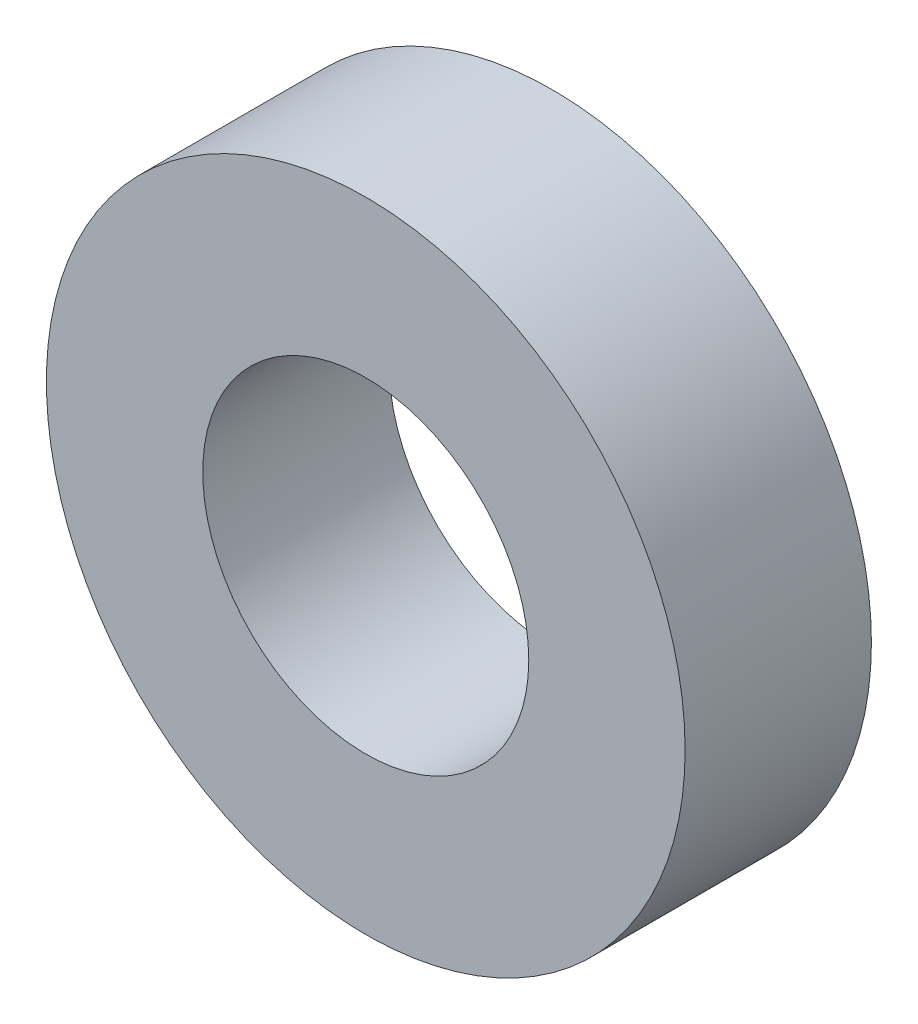
ISO-10303-21;
HEADER;
FILE_DESCRIPTION(('STEP AP214'),'2;1');
FILE_NAME('part.step','',(''),(''),'','','');
FILE_SCHEMA(('AUTOMOTIVE_DESIGN { 1 0 10303 214 1 1 1 1 }'));
ENDSEC;
DATA;
#1=APPLICATION_CONTEXT('core data for automotive mechanical design processes');
#2=APPLICATION_PROTOCOL_DEFINITION('international standard','automotive_design',2000,#1);
#3=PRODUCT_CONTEXT('',#1,'mechanical');
#4=PRODUCT('Part','Part','',(#3));
#5=PRODUCT_RELATED_PRODUCT_CATEGORY('part','',(#4));
#6=PRODUCT_DEFINITION_FORMATION('','',#4);
#7=PRODUCT_DEFINITION_CONTEXT('part definition',#1,'design');
#8=PRODUCT_DEFINITION('design','',#6,#7);
#9=PRODUCT_DEFINITION_SHAPE('','',#8);
#10=(LENGTH_UNIT() NAMED_UNIT(*) SI_UNIT(.MILLI.,.METRE.));
#11=(NAMED_UNIT(*) PLANE_ANGLE_UNIT() SI_UNIT($,.RADIAN.));
#12=(NAMED_UNIT(*) SI_UNIT($,.STERADIAN.) SOLID_ANGLE_UNIT());
#13=UNCERTAINTY_MEASURE_WITH_UNIT(LENGTH_MEASURE(1.E-05),#10,'distance_accuracy_value','');
#14=(GEOMETRIC_REPRESENTATION_CONTEXT(3) GLOBAL_UNCERTAINTY_ASSIGNED_CONTEXT((#13)) GLOBAL_UNIT_ASSIGNED_CONTEXT((#10,
#11,#12)) REPRESENTATION_CONTEXT('',''));
#15=CARTESIAN_POINT('',(0.,0.,0.));
#16=DIRECTION('',(0.,0.,1.));
#17=DIRECTION('',(1.,0.,0.));
#18=AXIS2_PLACEMENT_3D('',#15,#16,#17);
#19=CARTESIAN_POINT('',(0.,0.,7.));
#20=DIRECTION('',(0.,0.,1.));
#21=DIRECTION('',(1.,0.,0.));
#22=AXIS2_PLACEMENT_3D('',#19,#20,#21);
#23=PLANE('',#22);
#24=CARTESIAN_POINT('',(0.,0.,7.));
#25=DIRECTION('',(0.,0.,1.));
#26=DIRECTION('',(1.,0.,0.));
#27=AXIS2_PLACEMENT_3D('',#24,#25,#26);
#28=CIRCLE('',#27,12.);
#29=CARTESIAN_POINT('',(12.,0.,7.));
#30=VERTEX_POINT('',#29);
#31=EDGE_CURVE('E10',#30,#30,#28,.T.);
#32=ORIENTED_EDGE('',*,*,#31,.T.);
#33=EDGE_LOOP('',(#32));
#34=FACE_BOUND('',#33,.T.);
#35=CARTESIAN_POINT('',(0.,0.,7.));
#36=DIRECTION('',(0.,0.,1.));
#37=DIRECTION('',(1.,0.,0.));
#38=AXIS2_PLACEMENT_3D('',#35,#36,#37);
#39=CIRCLE('',#38,6.125);
#40=CARTESIAN_POINT('',(6.125,0.,7.));
#41=VERTEX_POINT('',#40);
#42=EDGE_CURVE('E42',#41,#41,#39,.T.);
#43=ORIENTED_EDGE('',*,*,#42,.F.);
#44=EDGE_LOOP('',(#43));
#45=FACE_BOUND('',#44,.T.);
#46=ADVANCED_FACE('F31',(#34,#45),#23,.T.);
#47=CARTESIAN_POINT('',(0.,0.,0.));
#48=DIRECTION('',(0.,0.,1.));
#49=DIRECTION('',(1.,0.,0.));
#50=AXIS2_PLACEMENT_3D('',#47,#48,#49);
#51=PLANE('',#50);
#52=CARTESIAN_POINT('',(0.,0.,0.));
#53=DIRECTION('',(0.,0.,1.));
#54=DIRECTION('',(1.,0.,0.));
#55=AXIS2_PLACEMENT_3D('',#52,#53,#54);
#56=CIRCLE('',#55,12.);
#57=CARTESIAN_POINT('',(12.,0.,0.));
#58=VERTEX_POINT('',#57);
#59=EDGE_CURVE('E35',#58,#58,#56,.T.);
#60=ORIENTED_EDGE('',*,*,#59,.F.);
#61=EDGE_LOOP('',(#60));
#62=FACE_BOUND('',#61,.T.);
#63=CARTESIAN_POINT('',(0.,0.,0.));
#64=DIRECTION('',(0.,0.,1.));
#65=DIRECTION('',(1.,0.,0.));
#66=AXIS2_PLACEMENT_3D('',#63,#64,#65);
#67=CIRCLE('',#66,6.125);
#68=CARTESIAN_POINT('',(6.125,0.,0.));
#69=VERTEX_POINT('',#68);
#70=EDGE_CURVE('E44',#69,#69,#67,.T.);
#71=ORIENTED_EDGE('',*,*,#70,.T.);
#72=EDGE_LOOP('',(#71));
#73=FACE_BOUND('',#72,.T.);
#74=ADVANCED_FACE('F54',(#62,#73),#51,.F.);
#75=CARTESIAN_POINT('',(0.,0.,7.));
#76=DIRECTION('',(0.,0.,-1.));
#77=DIRECTION('',(-1.,0.,0.));
#78=AXIS2_PLACEMENT_3D('',#75,#76,#77);
#79=CYLINDRICAL_SURFACE('',#78,12.);
#80=ORIENTED_EDGE('',*,*,#31,.F.);
#81=EDGE_LOOP('',(#80));
#82=FACE_BOUND('',#81,.T.);
#83=ORIENTED_EDGE('',*,*,#59,.T.);
#84=EDGE_LOOP('',(#83));
#85=FACE_BOUND('',#84,.T.);
#86=ADVANCED_FACE('F33',(#82,#85),#79,.T.);
#87=CARTESIAN_POINT('',(0.,0.,7.));
#88=DIRECTION('',(0.,0.,-1.));
#89=DIRECTION('',(-1.,0.,0.));
#90=AXIS2_PLACEMENT_3D('',#87,#88,#89);
#91=CYLINDRICAL_SURFACE('',#90,6.125);
#92=ORIENTED_EDGE('',*,*,#42,.T.);
#93=EDGE_LOOP('',(#92));
#94=FACE_BOUND('',#93,.T.);
#95=ORIENTED_EDGE('',*,*,#70,.F.);
#96=EDGE_LOOP('',(#95));
#97=FACE_BOUND('',#96,.T.);
#98=ADVANCED_FACE('F50',(#94,#97),#91,.F.);
#99=CLOSED_SHELL('',(#46,#74,#86,#98));
#100=MANIFOLD_SOLID_BREP('B2',#99);
#101=ADVANCED_BREP_SHAPE_REPRESENTATION('',(#18,#100),#14);
#102=SHAPE_DEFINITION_REPRESENTATION(#9,#101);
ENDSEC;
END-ISO-10303-21;
